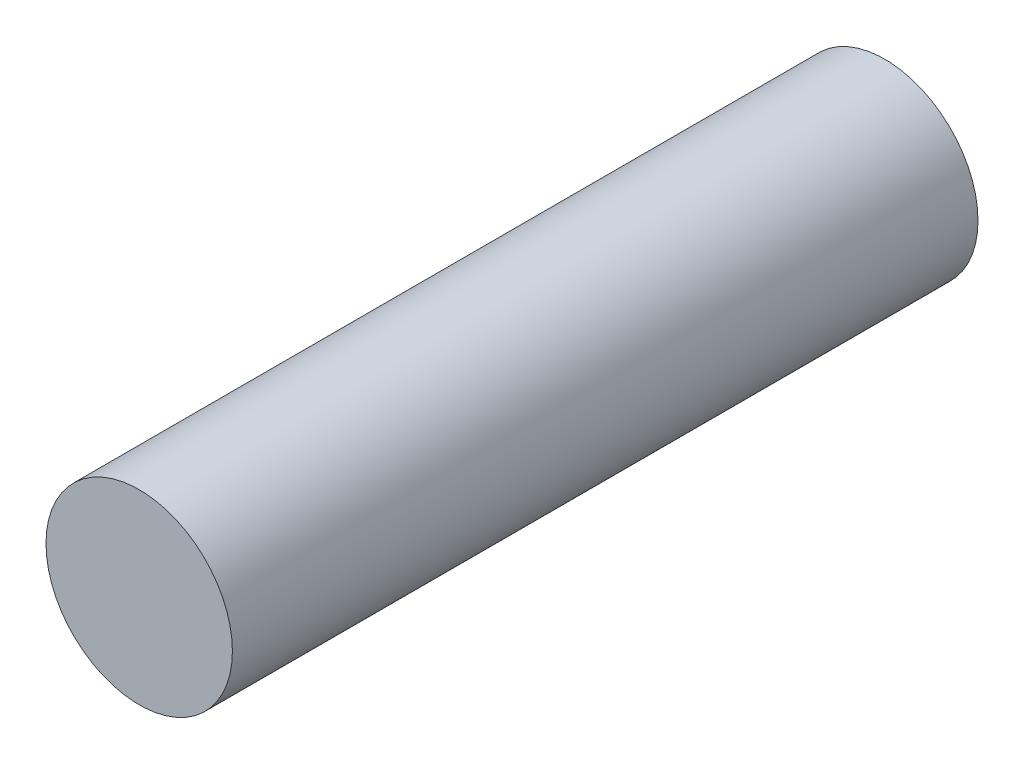
ISO-10303-21;
HEADER;
FILE_DESCRIPTION(('STEP AP214'),'2;1');
FILE_NAME('part.step','',(''),(''),'','','');
FILE_SCHEMA(('AUTOMOTIVE_DESIGN { 1 0 10303 214 1 1 1 1 }'));
ENDSEC;
DATA;
#1=APPLICATION_CONTEXT('core data for automotive mechanical design processes');
#2=APPLICATION_PROTOCOL_DEFINITION('international standard','automotive_design',2000,#1);
#3=PRODUCT_CONTEXT('',#1,'mechanical');
#4=PRODUCT('Part','Part','',(#3));
#5=PRODUCT_RELATED_PRODUCT_CATEGORY('part','',(#4));
#6=PRODUCT_DEFINITION_FORMATION('','',#4);
#7=PRODUCT_DEFINITION_CONTEXT('part definition',#1,'design');
#8=PRODUCT_DEFINITION('design','',#6,#7);
#9=PRODUCT_DEFINITION_SHAPE('','',#8);
#10=(LENGTH_UNIT() NAMED_UNIT(*) SI_UNIT(.MILLI.,.METRE.));
#11=(NAMED_UNIT(*) PLANE_ANGLE_UNIT() SI_UNIT($,.RADIAN.));
#12=(NAMED_UNIT(*) SI_UNIT($,.STERADIAN.) SOLID_ANGLE_UNIT());
#13=UNCERTAINTY_MEASURE_WITH_UNIT(LENGTH_MEASURE(1.E-05),#10,'distance_accuracy_value','');
#14=(GEOMETRIC_REPRESENTATION_CONTEXT(3) GLOBAL_UNCERTAINTY_ASSIGNED_CONTEXT((#13)) GLOBAL_UNIT_ASSIGNED_CONTEXT((#10,
#11,#12)) REPRESENTATION_CONTEXT('',''));
#15=CARTESIAN_POINT('',(0.,0.,0.));
#16=DIRECTION('',(0.,0.,1.));
#17=DIRECTION('',(1.,0.,0.));
#18=AXIS2_PLACEMENT_3D('',#15,#16,#17);
#19=CARTESIAN_POINT('',(0.,0.,28.));
#20=DIRECTION('',(0.,0.,-1.));
#21=DIRECTION('',(-1.,0.,0.));
#22=AXIS2_PLACEMENT_3D('',#19,#20,#21);
#23=CYLINDRICAL_SURFACE('',#22,3.5);
#24=CARTESIAN_POINT('',(0.,0.,28.));
#25=DIRECTION('',(0.,0.,1.));
#26=DIRECTION('',(1.,0.,0.));
#27=AXIS2_PLACEMENT_3D('',#24,#25,#26);
#28=CIRCLE('',#27,3.5);
#29=CARTESIAN_POINT('',(3.5,0.,28.));
#30=VERTEX_POINT('',#29);
#31=EDGE_CURVE('E10',#30,#30,#28,.T.);
#32=ORIENTED_EDGE('',*,*,#31,.F.);
#33=EDGE_LOOP('',(#32));
#34=FACE_BOUND('',#33,.T.);
#35=CARTESIAN_POINT('',(0.,0.,0.));
#36=DIRECTION('',(0.,0.,1.));
#37=DIRECTION('',(1.,0.,0.));
#38=AXIS2_PLACEMENT_3D('',#35,#36,#37);
#39=CIRCLE('',#38,3.5);
#40=CARTESIAN_POINT('',(3.5,0.,0.));
#41=VERTEX_POINT('',#40);
#42=EDGE_CURVE('E34',#41,#41,#39,.T.);
#43=ORIENTED_EDGE('',*,*,#42,.T.);
#44=EDGE_LOOP('',(#43));
#45=FACE_BOUND('',#44,.T.);
#46=ADVANCED_FACE('F31',(#34,#45),#23,.T.);
#47=CARTESIAN_POINT('',(0.,0.,28.));
#48=DIRECTION('',(0.,0.,1.));
#49=DIRECTION('',(1.,0.,0.));
#50=AXIS2_PLACEMENT_3D('',#47,#48,#49);
#51=PLANE('',#50);
#52=ORIENTED_EDGE('',*,*,#31,.T.);
#53=EDGE_LOOP('',(#52));
#54=FACE_BOUND('',#53,.T.);
#55=ADVANCED_FACE('F46',(#54),#51,.T.);
#56=CARTESIAN_POINT('',(0.,0.,0.));
#57=DIRECTION('',(0.,0.,1.));
#58=DIRECTION('',(1.,0.,0.));
#59=AXIS2_PLACEMENT_3D('',#56,#57,#58);
#60=PLANE('',#59);
#61=ORIENTED_EDGE('',*,*,#42,.F.);
#62=EDGE_LOOP('',(#61));
#63=FACE_BOUND('',#62,.T.);
#64=ADVANCED_FACE('F44',(#63),#60,.F.);
#65=CLOSED_SHELL('',(#46,#55,#64));
#66=MANIFOLD_SOLID_BREP('B2',#65);
#67=ADVANCED_BREP_SHAPE_REPRESENTATION('',(#18,#66),#14);
#68=SHAPE_DEFINITION_REPRESENTATION(#9,#67);
ENDSEC;
END-ISO-10303-21;
